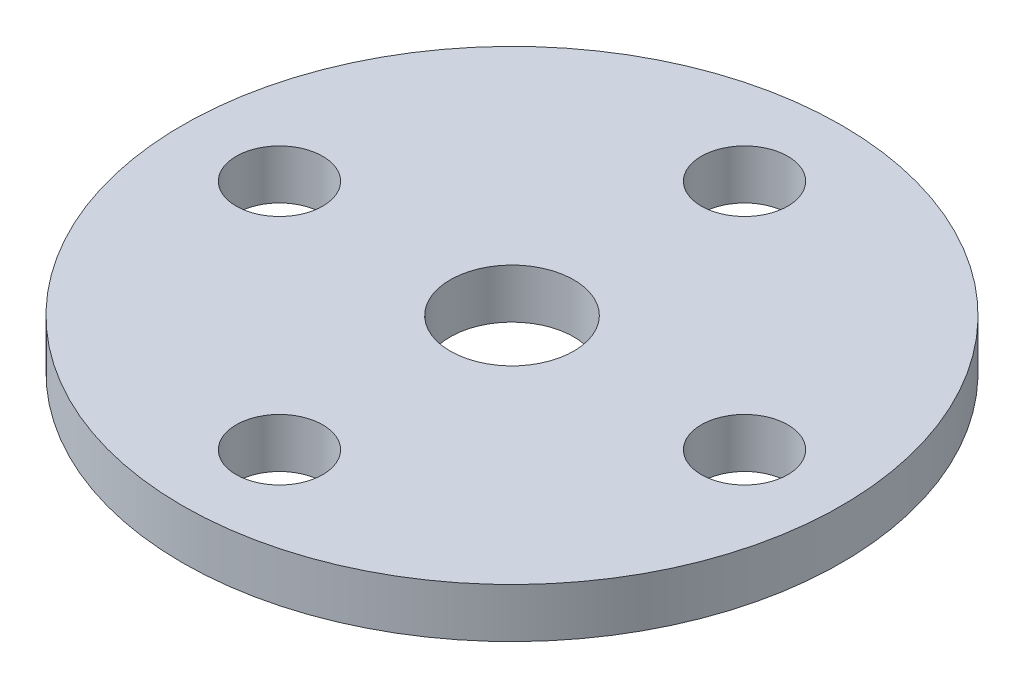
ISO-10303-21;
HEADER;
FILE_DESCRIPTION(('STEP AP214'),'2;1');
FILE_NAME('part.step','',(''),(''),'','','');
FILE_SCHEMA(('AUTOMOTIVE_DESIGN { 1 0 10303 214 1 1 1 1 }'));
ENDSEC;
DATA;
#1=APPLICATION_CONTEXT('core data for automotive mechanical design processes');
#2=APPLICATION_PROTOCOL_DEFINITION('international standard','automotive_design',2000,#1);
#3=PRODUCT_CONTEXT('',#1,'mechanical');
#4=PRODUCT('Part','Part','',(#3));
#5=PRODUCT_RELATED_PRODUCT_CATEGORY('part','',(#4));
#6=PRODUCT_DEFINITION_FORMATION('','',#4);
#7=PRODUCT_DEFINITION_CONTEXT('part definition',#1,'design');
#8=PRODUCT_DEFINITION('design','',#6,#7);
#9=PRODUCT_DEFINITION_SHAPE('','',#8);
#10=(LENGTH_UNIT() NAMED_UNIT(*) SI_UNIT(.MILLI.,.METRE.));
#11=(NAMED_UNIT(*) PLANE_ANGLE_UNIT() SI_UNIT($,.RADIAN.));
#12=(NAMED_UNIT(*) SI_UNIT($,.STERADIAN.) SOLID_ANGLE_UNIT());
#13=UNCERTAINTY_MEASURE_WITH_UNIT(LENGTH_MEASURE(1.E-05),#10,'distance_accuracy_value','');
#14=(GEOMETRIC_REPRESENTATION_CONTEXT(3) GLOBAL_UNCERTAINTY_ASSIGNED_CONTEXT((#13)) GLOBAL_UNIT_ASSIGNED_CONTEXT((#10,
#11,#12)) REPRESENTATION_CONTEXT('',''));
#15=CARTESIAN_POINT('',(0.,0.,0.));
#16=DIRECTION('',(0.,0.,1.));
#17=DIRECTION('',(1.,0.,0.));
#18=AXIS2_PLACEMENT_3D('',#15,#16,#17);
#19=CARTESIAN_POINT('',(0.,2.4,0.));
#20=DIRECTION('',(0.,-1.,0.));
#21=DIRECTION('',(0.,0.,-1.));
#22=AXIS2_PLACEMENT_3D('',#19,#20,#21);
#23=CYLINDRICAL_SURFACE('',#22,16.);
#24=CARTESIAN_POINT('',(0.,2.4,0.));
#25=DIRECTION('',(0.,1.,0.));
#26=DIRECTION('',(0.,0.,1.));
#27=AXIS2_PLACEMENT_3D('',#24,#25,#26);
#28=CIRCLE('',#27,16.);
#29=CARTESIAN_POINT('',(0.,2.4,16.));
#30=VERTEX_POINT('',#29);
#31=EDGE_CURVE('E10',#30,#30,#28,.T.);
#32=ORIENTED_EDGE('',*,*,#31,.F.);
#33=EDGE_LOOP('',(#32));
#34=FACE_BOUND('',#33,.T.);
#35=CARTESIAN_POINT('',(0.,0.,0.));
#36=DIRECTION('',(0.,1.,0.));
#37=DIRECTION('',(0.,0.,1.));
#38=AXIS2_PLACEMENT_3D('',#35,#36,#37);
#39=CIRCLE('',#38,16.);
#40=CARTESIAN_POINT('',(0.,0.,16.));
#41=VERTEX_POINT('',#40);
#42=EDGE_CURVE('E33',#41,#41,#39,.T.);
#43=ORIENTED_EDGE('',*,*,#42,.T.);
#44=EDGE_LOOP('',(#43));
#45=FACE_BOUND('',#44,.T.);
#46=ADVANCED_FACE('F30',(#34,#45),#23,.T.);
#47=CARTESIAN_POINT('',(0.,2.4,0.));
#48=DIRECTION('',(0.,1.,0.));
#49=DIRECTION('',(0.,0.,1.));
#50=AXIS2_PLACEMENT_3D('',#47,#48,#49);
#51=PLANE('',#50);
#52=CARTESIAN_POINT('',(0.,2.4,0.));
#53=DIRECTION('',(0.,1.,0.));
#54=DIRECTION('',(0.,0.,1.));
#55=AXIS2_PLACEMENT_3D('',#52,#53,#54);
#56=CIRCLE('',#55,3.);
#57=CARTESIAN_POINT('',(0.,2.4,3.));
#58=VERTEX_POINT('',#57);
#59=EDGE_CURVE('E68',#58,#58,#56,.T.);
#60=ORIENTED_EDGE('',*,*,#59,.F.);
#61=EDGE_LOOP('',(#60));
#62=FACE_BOUND('',#61,.T.);
#63=CARTESIAN_POINT('',(-11.2899999999997,2.4,3.20881099469261E-13));
#64=DIRECTION('',(0.,1.,0.));
#65=DIRECTION('',(0.,0.,1.));
#66=AXIS2_PLACEMENT_3D('',#63,#64,#65);
#67=CIRCLE('',#66,2.10000000000051);
#68=CARTESIAN_POINT('',(-11.2899999999997,2.4,2.10000000000084));
#69=VERTEX_POINT('',#68);
#70=EDGE_CURVE('E62',#69,#69,#67,.T.);
#71=ORIENTED_EDGE('',*,*,#70,.F.);
#72=EDGE_LOOP('',(#71));
#73=FACE_BOUND('',#72,.T.);
#74=CARTESIAN_POINT('',(6.38996946466048E-13,2.4,11.29));
#75=DIRECTION('',(0.,1.,0.));
#76=DIRECTION('',(0.,0.,1.));
#77=AXIS2_PLACEMENT_3D('',#74,#75,#76);
#78=CIRCLE('',#77,2.10000000000069);
#79=CARTESIAN_POINT('',(6.38996946466048E-13,2.4,13.3900000000007));
#80=VERTEX_POINT('',#79);
#81=EDGE_CURVE('E56',#80,#80,#78,.T.);
#82=ORIENTED_EDGE('',*,*,#81,.F.);
#83=EDGE_LOOP('',(#82));
#84=FACE_BOUND('',#83,.T.);
#85=CARTESIAN_POINT('',(11.2900000000003,2.4,-3.19498473233024E-13));
#86=DIRECTION('',(0.,1.,0.));
#87=DIRECTION('',(0.,0.,1.));
#88=AXIS2_PLACEMENT_3D('',#85,#86,#87);
#89=CIRCLE('',#88,2.10000000000025);
#90=CARTESIAN_POINT('',(11.2900000000003,2.4,2.09999999999993));
#91=VERTEX_POINT('',#90);
#92=EDGE_CURVE('E50',#91,#91,#89,.T.);
#93=ORIENTED_EDGE('',*,*,#92,.F.);
#94=EDGE_LOOP('',(#93));
#95=FACE_BOUND('',#94,.T.);
#96=CARTESIAN_POINT('',(0.,2.4,-11.29));
#97=DIRECTION('',(0.,1.,0.));
#98=DIRECTION('',(0.,0.,1.));
#99=AXIS2_PLACEMENT_3D('',#96,#97,#98);
#100=CIRCLE('',#99,2.1);
#101=CARTESIAN_POINT('',(0.,2.4,-9.19));
#102=VERTEX_POINT('',#101);
#103=EDGE_CURVE('E44',#102,#102,#100,.T.);
#104=ORIENTED_EDGE('',*,*,#103,.F.);
#105=EDGE_LOOP('',(#104));
#106=FACE_BOUND('',#105,.T.);
#107=ORIENTED_EDGE('',*,*,#31,.T.);
#108=EDGE_LOOP('',(#107));
#109=FACE_BOUND('',#108,.T.);
#110=ADVANCED_FACE('F75',(#62,#73,#84,#95,#106,#109),#51,.T.);
#111=CARTESIAN_POINT('',(0.,0.,0.));
#112=DIRECTION('',(0.,1.,0.));
#113=DIRECTION('',(0.,0.,1.));
#114=AXIS2_PLACEMENT_3D('',#111,#112,#113);
#115=PLANE('',#114);
#116=CARTESIAN_POINT('',(0.,0.,0.));
#117=DIRECTION('',(0.,1.,0.));
#118=DIRECTION('',(0.,0.,1.));
#119=AXIS2_PLACEMENT_3D('',#116,#117,#118);
#120=CIRCLE('',#119,3.);
#121=CARTESIAN_POINT('',(0.,0.,3.));
#122=VERTEX_POINT('',#121);
#123=EDGE_CURVE('E65',#122,#122,#120,.F.);
#124=ORIENTED_EDGE('',*,*,#123,.F.);
#125=EDGE_LOOP('',(#124));
#126=FACE_BOUND('',#125,.T.);
#127=CARTESIAN_POINT('',(-11.2899999999997,0.,3.20881099469261E-13));
#128=DIRECTION('',(0.,1.,0.));
#129=DIRECTION('',(0.,0.,1.));
#130=AXIS2_PLACEMENT_3D('',#127,#128,#129);
#131=CIRCLE('',#130,2.10000000000051);
#132=CARTESIAN_POINT('',(-11.2899999999997,0.,2.10000000000084));
#133=VERTEX_POINT('',#132);
#134=EDGE_CURVE('E59',#133,#133,#131,.F.);
#135=ORIENTED_EDGE('',*,*,#134,.F.);
#136=EDGE_LOOP('',(#135));
#137=FACE_BOUND('',#136,.T.);
#138=CARTESIAN_POINT('',(6.38996946466048E-13,0.,11.29));
#139=DIRECTION('',(0.,1.,0.));
#140=DIRECTION('',(0.,0.,1.));
#141=AXIS2_PLACEMENT_3D('',#138,#139,#140);
#142=CIRCLE('',#141,2.10000000000069);
#143=CARTESIAN_POINT('',(6.38996946466048E-13,0.,13.3900000000007));
#144=VERTEX_POINT('',#143);
#145=EDGE_CURVE('E53',#144,#144,#142,.F.);
#146=ORIENTED_EDGE('',*,*,#145,.F.);
#147=EDGE_LOOP('',(#146));
#148=FACE_BOUND('',#147,.T.);
#149=CARTESIAN_POINT('',(11.2900000000003,0.,-3.19498473233024E-13));
#150=DIRECTION('',(0.,1.,0.));
#151=DIRECTION('',(0.,0.,1.));
#152=AXIS2_PLACEMENT_3D('',#149,#150,#151);
#153=CIRCLE('',#152,2.10000000000025);
#154=CARTESIAN_POINT('',(11.2900000000003,0.,2.09999999999993));
#155=VERTEX_POINT('',#154);
#156=EDGE_CURVE('E47',#155,#155,#153,.F.);
#157=ORIENTED_EDGE('',*,*,#156,.F.);
#158=EDGE_LOOP('',(#157));
#159=FACE_BOUND('',#158,.T.);
#160=CARTESIAN_POINT('',(0.,0.,-11.29));
#161=DIRECTION('',(0.,1.,0.));
#162=DIRECTION('',(0.,0.,1.));
#163=AXIS2_PLACEMENT_3D('',#160,#161,#162);
#164=CIRCLE('',#163,2.1);
#165=CARTESIAN_POINT('',(0.,0.,-9.19));
#166=VERTEX_POINT('',#165);
#167=EDGE_CURVE('E40',#166,#166,#164,.F.);
#168=ORIENTED_EDGE('',*,*,#167,.F.);
#169=EDGE_LOOP('',(#168));
#170=FACE_BOUND('',#169,.T.);
#171=ORIENTED_EDGE('',*,*,#42,.F.);
#172=EDGE_LOOP('',(#171));
#173=FACE_BOUND('',#172,.T.);
#174=ADVANCED_FACE('F78',(#126,#137,#148,#159,#170,#173),#115,.F.);
#175=CARTESIAN_POINT('',(0.,-0.00100000000000013,-11.29));
#176=DIRECTION('',(0.,1.,0.));
#177=DIRECTION('',(0.,0.,1.));
#178=AXIS2_PLACEMENT_3D('',#175,#176,#177);
#179=CYLINDRICAL_SURFACE('',#178,2.1);
#180=ORIENTED_EDGE('',*,*,#103,.T.);
#181=EDGE_LOOP('',(#180));
#182=FACE_BOUND('',#181,.T.);
#183=ORIENTED_EDGE('',*,*,#167,.T.);
#184=EDGE_LOOP('',(#183));
#185=FACE_BOUND('',#184,.T.);
#186=ADVANCED_FACE('F88',(#182,#185),#179,.F.);
#187=CARTESIAN_POINT('',(11.2900000000003,-0.00100000000000013,-3.19498473233024E-13));
#188=DIRECTION('',(0.,1.,0.));
#189=DIRECTION('',(0.,0.,1.));
#190=AXIS2_PLACEMENT_3D('',#187,#188,#189);
#191=CYLINDRICAL_SURFACE('',#190,2.10000000000025);
#192=ORIENTED_EDGE('',*,*,#92,.T.);
#193=EDGE_LOOP('',(#192));
#194=FACE_BOUND('',#193,.T.);
#195=ORIENTED_EDGE('',*,*,#156,.T.);
#196=EDGE_LOOP('',(#195));
#197=FACE_BOUND('',#196,.T.);
#198=ADVANCED_FACE('F91',(#194,#197),#191,.F.);
#199=CARTESIAN_POINT('',(6.38996946466048E-13,-0.00100000000000013,11.29));
#200=DIRECTION('',(0.,1.,0.));
#201=DIRECTION('',(0.,0.,1.));
#202=AXIS2_PLACEMENT_3D('',#199,#200,#201);
#203=CYLINDRICAL_SURFACE('',#202,2.10000000000069);
#204=ORIENTED_EDGE('',*,*,#81,.T.);
#205=EDGE_LOOP('',(#204));
#206=FACE_BOUND('',#205,.T.);
#207=ORIENTED_EDGE('',*,*,#145,.T.);
#208=EDGE_LOOP('',(#207));
#209=FACE_BOUND('',#208,.T.);
#210=ADVANCED_FACE('F124',(#206,#209),#203,.F.);
#211=CARTESIAN_POINT('',(-11.2899999999997,-0.00100000000000013,3.20881099469261E-13));
#212=DIRECTION('',(0.,1.,0.));
#213=DIRECTION('',(0.,0.,1.));
#214=AXIS2_PLACEMENT_3D('',#211,#212,#213);
#215=CYLINDRICAL_SURFACE('',#214,2.10000000000051);
#216=ORIENTED_EDGE('',*,*,#70,.T.);
#217=EDGE_LOOP('',(#216));
#218=FACE_BOUND('',#217,.T.);
#219=ORIENTED_EDGE('',*,*,#134,.T.);
#220=EDGE_LOOP('',(#219));
#221=FACE_BOUND('',#220,.T.);
#222=ADVANCED_FACE('F132',(#218,#221),#215,.F.);
#223=CARTESIAN_POINT('',(0.,-0.00100000000000013,0.));
#224=DIRECTION('',(0.,1.,0.));
#225=DIRECTION('',(0.,0.,1.));
#226=AXIS2_PLACEMENT_3D('',#223,#224,#225);
#227=CYLINDRICAL_SURFACE('',#226,3.);
#228=ORIENTED_EDGE('',*,*,#59,.T.);
#229=EDGE_LOOP('',(#228));
#230=FACE_BOUND('',#229,.T.);
#231=ORIENTED_EDGE('',*,*,#123,.T.);
#232=EDGE_LOOP('',(#231));
#233=FACE_BOUND('',#232,.T.);
#234=ADVANCED_FACE('F72',(#230,#233),#227,.F.);
#235=CLOSED_SHELL('',(#46,#110,#174,#186,#198,#210,#222,#234));
#236=MANIFOLD_SOLID_BREP('B2',#235);
#237=ADVANCED_BREP_SHAPE_REPRESENTATION('',(#18,#236),#14);
#238=SHAPE_DEFINITION_REPRESENTATION(#9,#237);
ENDSEC;
END-ISO-10303-21;
